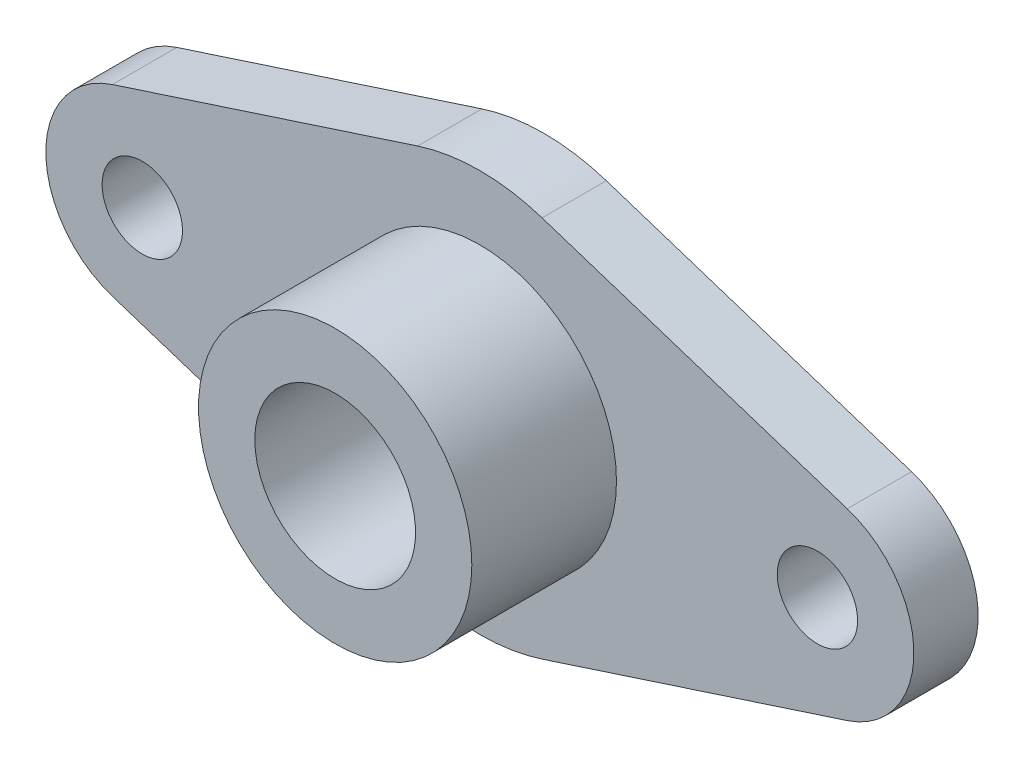
ISO-10303-21;
HEADER;
FILE_DESCRIPTION(('STEP AP214'),'2;1');
FILE_NAME('part.step','',(''),(''),'','','');
FILE_SCHEMA(('AUTOMOTIVE_DESIGN { 1 0 10303 214 1 1 1 1 }'));
ENDSEC;
DATA;
#1=APPLICATION_CONTEXT('core data for automotive mechanical design processes');
#2=APPLICATION_PROTOCOL_DEFINITION('international standard','automotive_design',2000,#1);
#3=PRODUCT_CONTEXT('',#1,'mechanical');
#4=PRODUCT('Part','Part','',(#3));
#5=PRODUCT_RELATED_PRODUCT_CATEGORY('part','',(#4));
#6=PRODUCT_DEFINITION_FORMATION('','',#4);
#7=PRODUCT_DEFINITION_CONTEXT('part definition',#1,'design');
#8=PRODUCT_DEFINITION('design','',#6,#7);
#9=PRODUCT_DEFINITION_SHAPE('','',#8);
#10=(LENGTH_UNIT() NAMED_UNIT(*) SI_UNIT(.MILLI.,.METRE.));
#11=(NAMED_UNIT(*) PLANE_ANGLE_UNIT() SI_UNIT($,.RADIAN.));
#12=(NAMED_UNIT(*) SI_UNIT($,.STERADIAN.) SOLID_ANGLE_UNIT());
#13=UNCERTAINTY_MEASURE_WITH_UNIT(LENGTH_MEASURE(1.E-05),#10,'distance_accuracy_value','');
#14=(GEOMETRIC_REPRESENTATION_CONTEXT(3) GLOBAL_UNCERTAINTY_ASSIGNED_CONTEXT((#13)) GLOBAL_UNIT_ASSIGNED_CONTEXT((#10,
#11,#12)) REPRESENTATION_CONTEXT('',''));
#15=CARTESIAN_POINT('',(0.,0.,0.));
#16=DIRECTION('',(0.,0.,1.));
#17=DIRECTION('',(1.,0.,0.));
#18=AXIS2_PLACEMENT_3D('',#15,#16,#17);
#19=CARTESIAN_POINT('',(0.,-0.0001472342694743,8.));
#20=DIRECTION('',(0.,0.,-1.));
#21=DIRECTION('',(-1.,0.,0.));
#22=AXIS2_PLACEMENT_3D('',#19,#20,#21);
#23=CYLINDRICAL_SURFACE('',#22,25.0001472342695);
#24=CARTESIAN_POINT('',(0.,-0.0001472342694743,0.));
#25=DIRECTION('',(0.,0.,1.));
#26=DIRECTION('',(1.,0.,0.));
#27=AXIS2_PLACEMENT_3D('',#24,#25,#26);
#28=CIRCLE('',#27,25.0001472342695);
#29=CARTESIAN_POINT('',(7.738095,23.7723,0.));
#30=VERTEX_POINT('',#29);
#31=CARTESIAN_POINT('',(-7.738095,23.7723,0.));
#32=VERTEX_POINT('',#31);
#33=EDGE_CURVE('E150',#30,#32,#28,.T.);
#34=ORIENTED_EDGE('',*,*,#33,.T.);
#35=DIRECTION('',(0.,0.,-1.));
#36=VECTOR('',#35,1.);
#37=CARTESIAN_POINT('',(-7.738095,23.7723,8.));
#38=LINE('',#37,#36);
#39=CARTESIAN_POINT('',(-7.738095,23.7723,8.));
#40=VERTEX_POINT('',#39);
#41=EDGE_CURVE('E48',#40,#32,#38,.T.);
#42=ORIENTED_EDGE('',*,*,#41,.F.);
#43=CARTESIAN_POINT('',(0.,-0.0001472342694743,8.));
#44=DIRECTION('',(0.,0.,1.));
#45=DIRECTION('',(1.,0.,0.));
#46=AXIS2_PLACEMENT_3D('',#43,#44,#45);
#47=CIRCLE('',#46,25.0001472342695);
#48=CARTESIAN_POINT('',(7.738095,23.7723,8.));
#49=VERTEX_POINT('',#48);
#50=EDGE_CURVE('E171',#49,#40,#47,.T.);
#51=ORIENTED_EDGE('',*,*,#50,.F.);
#52=DIRECTION('',(0.,0.,-1.));
#53=VECTOR('',#52,1.);
#54=CARTESIAN_POINT('',(7.738095,23.7723,8.));
#55=LINE('',#54,#53);
#56=EDGE_CURVE('E146',#49,#30,#55,.T.);
#57=ORIENTED_EDGE('',*,*,#56,.T.);
#58=EDGE_LOOP('',(#34,#42,#51,#57));
#59=FACE_BOUND('',#58,.T.);
#60=ADVANCED_FACE('F45',(#59),#23,.T.);
#61=CARTESIAN_POINT('',(-7.738095,23.7723,8.));
#62=DIRECTION('',(0.309523896094941,-0.950891664568687,0.));
#63=DIRECTION('',(0.950891664568687,0.309523896094941,0.));
#64=AXIS2_PLACEMENT_3D('',#61,#62,#63);
#65=PLANE('',#64);
#66=DIRECTION('',(-0.950891664568687,-0.309523896094941,0.));
#67=VECTOR('',#66,1.);
#68=CARTESIAN_POINT('',(-7.738095,23.7723,0.));
#69=LINE('',#68,#67);
#70=CARTESIAN_POINT('',(-45.714286,11.410704,0.));
#71=VERTEX_POINT('',#70);
#72=EDGE_CURVE('E153',#32,#71,#69,.T.);
#73=ORIENTED_EDGE('',*,*,#72,.T.);
#74=DIRECTION('',(0.,0.,-1.));
#75=VECTOR('',#74,1.);
#76=CARTESIAN_POINT('',(-45.714286,11.410704,8.));
#77=LINE('',#76,#75);
#78=CARTESIAN_POINT('',(-45.714286,11.410704,8.));
#79=VERTEX_POINT('',#78);
#80=EDGE_CURVE('E185',#79,#71,#77,.T.);
#81=ORIENTED_EDGE('',*,*,#80,.F.);
#82=DIRECTION('',(-0.950891664568687,-0.309523896094941,0.));
#83=VECTOR('',#82,1.);
#84=CARTESIAN_POINT('',(-7.738095,23.7723,8.));
#85=LINE('',#84,#83);
#86=EDGE_CURVE('E107',#40,#79,#85,.T.);
#87=ORIENTED_EDGE('',*,*,#86,.F.);
#88=ORIENTED_EDGE('',*,*,#41,.T.);
#89=EDGE_LOOP('',(#73,#81,#87,#88));
#90=FACE_BOUND('',#89,.T.);
#91=ADVANCED_FACE('F195',(#90),#65,.F.);
#92=CARTESIAN_POINT('',(-41.9999947943284,0.,8.));
#93=DIRECTION('',(0.,0.,-1.));
#94=DIRECTION('',(-1.,0.,0.));
#95=AXIS2_PLACEMENT_3D('',#92,#93,#94);
#96=CYLINDRICAL_SURFACE('',#95,12.0000052056716);
#97=CARTESIAN_POINT('',(-41.9999947943284,0.,0.));
#98=DIRECTION('',(0.,0.,1.));
#99=DIRECTION('',(1.,0.,0.));
#100=AXIS2_PLACEMENT_3D('',#97,#98,#99);
#101=CIRCLE('',#100,12.0000052056716);
#102=CARTESIAN_POINT('',(-45.714286,-11.410704,0.));
#103=VERTEX_POINT('',#102);
#104=EDGE_CURVE('E157',#71,#103,#101,.T.);
#105=ORIENTED_EDGE('',*,*,#104,.T.);
#106=DIRECTION('',(0.,0.,-1.));
#107=VECTOR('',#106,1.);
#108=CARTESIAN_POINT('',(-45.714286,-11.410704,8.));
#109=LINE('',#108,#107);
#110=CARTESIAN_POINT('',(-45.714286,-11.410704,8.));
#111=VERTEX_POINT('',#110);
#112=EDGE_CURVE('E182',#111,#103,#109,.T.);
#113=ORIENTED_EDGE('',*,*,#112,.F.);
#114=CARTESIAN_POINT('',(-41.9999947943284,0.,8.));
#115=DIRECTION('',(0.,0.,1.));
#116=DIRECTION('',(1.,0.,0.));
#117=AXIS2_PLACEMENT_3D('',#114,#115,#116);
#118=CIRCLE('',#117,12.0000052056716);
#119=EDGE_CURVE('E211',#79,#111,#118,.T.);
#120=ORIENTED_EDGE('',*,*,#119,.F.);
#121=ORIENTED_EDGE('',*,*,#80,.T.);
#122=EDGE_LOOP('',(#105,#113,#120,#121));
#123=FACE_BOUND('',#122,.T.);
#124=ADVANCED_FACE('F204',(#123),#96,.T.);
#125=CARTESIAN_POINT('',(-45.714286,-11.410704,8.));
#126=DIRECTION('',(0.309523896094941,0.950891664568687,0.));
#127=DIRECTION('',(-0.950891664568687,0.309523896094941,0.));
#128=AXIS2_PLACEMENT_3D('',#125,#126,#127);
#129=PLANE('',#128);
#130=DIRECTION('',(0.950891664568687,-0.309523896094941,0.));
#131=VECTOR('',#130,1.);
#132=CARTESIAN_POINT('',(-45.714286,-11.410704,0.));
#133=LINE('',#132,#131);
#134=CARTESIAN_POINT('',(-7.73809500000001,-23.7723,0.));
#135=VERTEX_POINT('',#134);
#136=EDGE_CURVE('E159',#103,#135,#133,.T.);
#137=ORIENTED_EDGE('',*,*,#136,.T.);
#138=DIRECTION('',(0.,0.,-1.));
#139=VECTOR('',#138,1.);
#140=CARTESIAN_POINT('',(-7.73809500000001,-23.7723,8.));
#141=LINE('',#140,#139);
#142=CARTESIAN_POINT('',(-7.73809500000001,-23.7723,8.));
#143=VERTEX_POINT('',#142);
#144=EDGE_CURVE('E178',#143,#135,#141,.T.);
#145=ORIENTED_EDGE('',*,*,#144,.F.);
#146=DIRECTION('',(0.950891664568687,-0.309523896094941,0.));
#147=VECTOR('',#146,1.);
#148=CARTESIAN_POINT('',(-45.714286,-11.410704,8.));
#149=LINE('',#148,#147);
#150=EDGE_CURVE('E209',#111,#143,#149,.T.);
#151=ORIENTED_EDGE('',*,*,#150,.F.);
#152=ORIENTED_EDGE('',*,*,#112,.T.);
#153=EDGE_LOOP('',(#137,#145,#151,#152));
#154=FACE_BOUND('',#153,.T.);
#155=ADVANCED_FACE('F207',(#154),#129,.F.);
#156=CARTESIAN_POINT('',(0.,0.0001472342694743,8.));
#157=DIRECTION('',(0.,0.,-1.));
#158=DIRECTION('',(-1.,0.,0.));
#159=AXIS2_PLACEMENT_3D('',#156,#157,#158);
#160=CYLINDRICAL_SURFACE('',#159,25.0001472342695);
#161=CARTESIAN_POINT('',(0.,0.0001472342694743,0.));
#162=DIRECTION('',(0.,0.,1.));
#163=DIRECTION('',(1.,0.,0.));
#164=AXIS2_PLACEMENT_3D('',#161,#162,#163);
#165=CIRCLE('',#164,25.0001472342695);
#166=CARTESIAN_POINT('',(7.738095,-23.7723,0.));
#167=VERTEX_POINT('',#166);
#168=EDGE_CURVE('E162',#135,#167,#165,.T.);
#169=ORIENTED_EDGE('',*,*,#168,.T.);
#170=DIRECTION('',(0.,0.,-1.));
#171=VECTOR('',#170,1.);
#172=CARTESIAN_POINT('',(7.738095,-23.7723,8.));
#173=LINE('',#172,#171);
#174=CARTESIAN_POINT('',(7.738095,-23.7723,8.));
#175=VERTEX_POINT('',#174);
#176=EDGE_CURVE('E137',#175,#167,#173,.T.);
#177=ORIENTED_EDGE('',*,*,#176,.F.);
#178=CARTESIAN_POINT('',(0.,0.0001472342694743,8.));
#179=DIRECTION('',(0.,0.,1.));
#180=DIRECTION('',(1.,0.,0.));
#181=AXIS2_PLACEMENT_3D('',#178,#179,#180);
#182=CIRCLE('',#181,25.0001472342695);
#183=EDGE_CURVE('E126',#143,#175,#182,.T.);
#184=ORIENTED_EDGE('',*,*,#183,.F.);
#185=ORIENTED_EDGE('',*,*,#144,.T.);
#186=EDGE_LOOP('',(#169,#177,#184,#185));
#187=FACE_BOUND('',#186,.T.);
#188=ADVANCED_FACE('F269',(#187),#160,.T.);
#189=CARTESIAN_POINT('',(7.738095,-23.7723,8.));
#190=DIRECTION('',(-0.309523896094941,0.950891664568687,0.));
#191=DIRECTION('',(-0.950891664568687,-0.309523896094941,0.));
#192=AXIS2_PLACEMENT_3D('',#189,#190,#191);
#193=PLANE('',#192);
#194=DIRECTION('',(0.950891664568687,0.309523896094941,0.));
#195=VECTOR('',#194,1.);
#196=CARTESIAN_POINT('',(7.738095,-23.7723,0.));
#197=LINE('',#196,#195);
#198=CARTESIAN_POINT('',(45.714286,-11.410704,0.));
#199=VERTEX_POINT('',#198);
#200=EDGE_CURVE('E135',#167,#199,#197,.T.);
#201=ORIENTED_EDGE('',*,*,#200,.T.);
#202=DIRECTION('',(0.,0.,-1.));
#203=VECTOR('',#202,1.);
#204=CARTESIAN_POINT('',(45.714286,-11.410704,8.));
#205=LINE('',#204,#203);
#206=CARTESIAN_POINT('',(45.714286,-11.410704,8.));
#207=VERTEX_POINT('',#206);
#208=EDGE_CURVE('E132',#207,#199,#205,.T.);
#209=ORIENTED_EDGE('',*,*,#208,.F.);
#210=DIRECTION('',(0.950891664568687,0.309523896094941,0.));
#211=VECTOR('',#210,1.);
#212=CARTESIAN_POINT('',(7.738095,-23.7723,8.));
#213=LINE('',#212,#211);
#214=EDGE_CURVE('E120',#175,#207,#213,.T.);
#215=ORIENTED_EDGE('',*,*,#214,.F.);
#216=ORIENTED_EDGE('',*,*,#176,.T.);
#217=EDGE_LOOP('',(#201,#209,#215,#216));
#218=FACE_BOUND('',#217,.T.);
#219=ADVANCED_FACE('F133',(#218),#193,.F.);
#220=CARTESIAN_POINT('',(41.9999947943284,0.,8.));
#221=DIRECTION('',(0.,0.,-1.));
#222=DIRECTION('',(-1.,0.,0.));
#223=AXIS2_PLACEMENT_3D('',#220,#221,#222);
#224=CYLINDRICAL_SURFACE('',#223,12.0000052056716);
#225=CARTESIAN_POINT('',(41.9999947943284,0.,0.));
#226=DIRECTION('',(0.,0.,1.));
#227=DIRECTION('',(1.,0.,0.));
#228=AXIS2_PLACEMENT_3D('',#225,#226,#227);
#229=CIRCLE('',#228,12.0000052056716);
#230=CARTESIAN_POINT('',(45.714286,11.410704,0.));
#231=VERTEX_POINT('',#230);
#232=EDGE_CURVE('E92',#199,#231,#229,.T.);
#233=ORIENTED_EDGE('',*,*,#232,.T.);
#234=DIRECTION('',(0.,0.,-1.));
#235=VECTOR('',#234,1.);
#236=CARTESIAN_POINT('',(45.714286,11.410704,8.));
#237=LINE('',#236,#235);
#238=CARTESIAN_POINT('',(45.714286,11.410704,8.));
#239=VERTEX_POINT('',#238);
#240=EDGE_CURVE('E138',#239,#231,#237,.T.);
#241=ORIENTED_EDGE('',*,*,#240,.F.);
#242=CARTESIAN_POINT('',(41.9999947943284,0.,8.));
#243=DIRECTION('',(0.,0.,1.));
#244=DIRECTION('',(1.,0.,0.));
#245=AXIS2_PLACEMENT_3D('',#242,#243,#244);
#246=CIRCLE('',#245,12.0000052056716);
#247=EDGE_CURVE('E124',#207,#239,#246,.T.);
#248=ORIENTED_EDGE('',*,*,#247,.F.);
#249=ORIENTED_EDGE('',*,*,#208,.T.);
#250=EDGE_LOOP('',(#233,#241,#248,#249));
#251=FACE_BOUND('',#250,.T.);
#252=ADVANCED_FACE('F140',(#251),#224,.T.);
#253=CARTESIAN_POINT('',(45.714286,11.410704,8.));
#254=DIRECTION('',(-0.309523896094941,-0.950891664568687,0.));
#255=DIRECTION('',(0.950891664568687,-0.309523896094941,0.));
#256=AXIS2_PLACEMENT_3D('',#253,#254,#255);
#257=PLANE('',#256);
#258=DIRECTION('',(-0.950891664568687,0.309523896094941,0.));
#259=VECTOR('',#258,1.);
#260=CARTESIAN_POINT('',(45.714286,11.410704,0.));
#261=LINE('',#260,#259);
#262=EDGE_CURVE('E98',#231,#30,#261,.T.);
#263=ORIENTED_EDGE('',*,*,#262,.T.);
#264=ORIENTED_EDGE('',*,*,#56,.F.);
#265=DIRECTION('',(-0.950891664568687,0.309523896094941,0.));
#266=VECTOR('',#265,1.);
#267=CARTESIAN_POINT('',(45.714286,11.410704,8.));
#268=LINE('',#267,#266);
#269=EDGE_CURVE('E63',#239,#49,#268,.T.);
#270=ORIENTED_EDGE('',*,*,#269,.F.);
#271=ORIENTED_EDGE('',*,*,#240,.T.);
#272=EDGE_LOOP('',(#263,#264,#270,#271));
#273=FACE_BOUND('',#272,.T.);
#274=ADVANCED_FACE('F277',(#273),#257,.F.);
#275=CARTESIAN_POINT('',(0.,-0.0001472342694743,8.));
#276=DIRECTION('',(0.,0.,1.));
#277=DIRECTION('',(1.,0.,0.));
#278=AXIS2_PLACEMENT_3D('',#275,#276,#277);
#279=PLANE('',#278);
#280=CARTESIAN_POINT('',(42.,0.,8.));
#281=DIRECTION('',(0.,0.,1.));
#282=DIRECTION('',(1.,0.,0.));
#283=AXIS2_PLACEMENT_3D('',#280,#281,#282);
#284=CIRCLE('',#283,5.);
#285=CARTESIAN_POINT('',(37.,0.,8.));
#286=VERTEX_POINT('',#285);
#287=EDGE_CURVE('E228',#286,#286,#284,.F.);
#288=ORIENTED_EDGE('',*,*,#287,.T.);
#289=EDGE_LOOP('',(#288));
#290=FACE_BOUND('',#289,.T.);
#291=CARTESIAN_POINT('',(-42.,0.,8.));
#292=DIRECTION('',(0.,0.,1.));
#293=DIRECTION('',(1.,0.,0.));
#294=AXIS2_PLACEMENT_3D('',#291,#292,#293);
#295=CIRCLE('',#294,5.);
#296=CARTESIAN_POINT('',(-47.,0.,8.));
#297=VERTEX_POINT('',#296);
#298=EDGE_CURVE('E235',#297,#297,#295,.F.);
#299=ORIENTED_EDGE('',*,*,#298,.T.);
#300=EDGE_LOOP('',(#299));
#301=FACE_BOUND('',#300,.T.);
#302=CARTESIAN_POINT('',(0.,0.,8.));
#303=DIRECTION('',(0.,0.,1.));
#304=DIRECTION('',(1.,0.,0.));
#305=AXIS2_PLACEMENT_3D('',#302,#303,#304);
#306=CIRCLE('',#305,17.);
#307=CARTESIAN_POINT('',(17.,0.,8.));
#308=VERTEX_POINT('',#307);
#309=EDGE_CURVE('E11',#308,#308,#306,.T.);
#310=ORIENTED_EDGE('',*,*,#309,.F.);
#311=EDGE_LOOP('',(#310));
#312=FACE_BOUND('',#311,.T.);
#313=ORIENTED_EDGE('',*,*,#50,.T.);
#314=ORIENTED_EDGE('',*,*,#86,.T.);
#315=ORIENTED_EDGE('',*,*,#119,.T.);
#316=ORIENTED_EDGE('',*,*,#150,.T.);
#317=ORIENTED_EDGE('',*,*,#183,.T.);
#318=ORIENTED_EDGE('',*,*,#214,.T.);
#319=ORIENTED_EDGE('',*,*,#247,.T.);
#320=ORIENTED_EDGE('',*,*,#269,.T.);
#321=EDGE_LOOP('',(#313,#314,#315,#316,#317,#318,#319,#320));
#322=FACE_BOUND('',#321,.T.);
#323=ADVANCED_FACE('F122',(#290,#301,#312,#322),#279,.T.);
#324=CARTESIAN_POINT('',(0.,-0.0001472342694743,0.));
#325=DIRECTION('',(0.,0.,1.));
#326=DIRECTION('',(1.,0.,0.));
#327=AXIS2_PLACEMENT_3D('',#324,#325,#326);
#328=PLANE('',#327);
#329=CARTESIAN_POINT('',(42.,0.,0.));
#330=DIRECTION('',(0.,0.,1.));
#331=DIRECTION('',(1.,0.,0.));
#332=AXIS2_PLACEMENT_3D('',#329,#330,#331);
#333=CIRCLE('',#332,5.);
#334=CARTESIAN_POINT('',(37.,0.,0.));
#335=VERTEX_POINT('',#334);
#336=EDGE_CURVE('E238',#335,#335,#333,.T.);
#337=ORIENTED_EDGE('',*,*,#336,.T.);
#338=EDGE_LOOP('',(#337));
#339=FACE_BOUND('',#338,.T.);
#340=CARTESIAN_POINT('',(-42.,0.,0.));
#341=DIRECTION('',(0.,0.,1.));
#342=DIRECTION('',(1.,0.,0.));
#343=AXIS2_PLACEMENT_3D('',#340,#341,#342);
#344=CIRCLE('',#343,5.);
#345=CARTESIAN_POINT('',(-47.,0.,0.));
#346=VERTEX_POINT('',#345);
#347=EDGE_CURVE('E239',#346,#346,#344,.T.);
#348=ORIENTED_EDGE('',*,*,#347,.T.);
#349=EDGE_LOOP('',(#348));
#350=FACE_BOUND('',#349,.T.);
#351=CARTESIAN_POINT('',(0.,0.,0.));
#352=DIRECTION('',(0.,0.,1.));
#353=DIRECTION('',(1.,0.,0.));
#354=AXIS2_PLACEMENT_3D('',#351,#352,#353);
#355=CIRCLE('',#354,10.);
#356=CARTESIAN_POINT('',(-10.,0.,0.));
#357=VERTEX_POINT('',#356);
#358=EDGE_CURVE('E224',#357,#357,#355,.T.);
#359=ORIENTED_EDGE('',*,*,#358,.T.);
#360=EDGE_LOOP('',(#359));
#361=FACE_BOUND('',#360,.T.);
#362=ORIENTED_EDGE('',*,*,#33,.F.);
#363=ORIENTED_EDGE('',*,*,#262,.F.);
#364=ORIENTED_EDGE('',*,*,#232,.F.);
#365=ORIENTED_EDGE('',*,*,#200,.F.);
#366=ORIENTED_EDGE('',*,*,#168,.F.);
#367=ORIENTED_EDGE('',*,*,#136,.F.);
#368=ORIENTED_EDGE('',*,*,#104,.F.);
#369=ORIENTED_EDGE('',*,*,#72,.F.);
#370=EDGE_LOOP('',(#362,#363,#364,#365,#366,#367,#368,#369));
#371=FACE_BOUND('',#370,.T.);
#372=ADVANCED_FACE('F200',(#339,#350,#361,#371),#328,.F.);
#373=CARTESIAN_POINT('',(0.,0.,26.));
#374=DIRECTION('',(0.,0.,-1.));
#375=DIRECTION('',(-1.,0.,0.));
#376=AXIS2_PLACEMENT_3D('',#373,#374,#375);
#377=CYLINDRICAL_SURFACE('',#376,17.);
#378=CARTESIAN_POINT('',(0.,0.,26.));
#379=DIRECTION('',(0.,0.,1.));
#380=DIRECTION('',(1.,0.,0.));
#381=AXIS2_PLACEMENT_3D('',#378,#379,#380);
#382=CIRCLE('',#381,17.);
#383=CARTESIAN_POINT('',(17.,0.,26.));
#384=VERTEX_POINT('',#383);
#385=EDGE_CURVE('E154',#384,#384,#382,.T.);
#386=ORIENTED_EDGE('',*,*,#385,.F.);
#387=EDGE_LOOP('',(#386));
#388=FACE_BOUND('',#387,.T.);
#389=ORIENTED_EDGE('',*,*,#309,.T.);
#390=EDGE_LOOP('',(#389));
#391=FACE_BOUND('',#390,.T.);
#392=ADVANCED_FACE('F282',(#388,#391),#377,.T.);
#393=CARTESIAN_POINT('',(0.,0.,26.));
#394=DIRECTION('',(0.,0.,1.));
#395=DIRECTION('',(1.,0.,0.));
#396=AXIS2_PLACEMENT_3D('',#393,#394,#395);
#397=PLANE('',#396);
#398=CARTESIAN_POINT('',(0.,0.,26.));
#399=DIRECTION('',(0.,0.,1.));
#400=DIRECTION('',(1.,0.,0.));
#401=AXIS2_PLACEMENT_3D('',#398,#399,#400);
#402=CIRCLE('',#401,10.);
#403=CARTESIAN_POINT('',(-10.,0.,26.));
#404=VERTEX_POINT('',#403);
#405=EDGE_CURVE('E223',#404,#404,#402,.T.);
#406=ORIENTED_EDGE('',*,*,#405,.F.);
#407=EDGE_LOOP('',(#406));
#408=FACE_BOUND('',#407,.T.);
#409=ORIENTED_EDGE('',*,*,#385,.T.);
#410=EDGE_LOOP('',(#409));
#411=FACE_BOUND('',#410,.T.);
#412=ADVANCED_FACE('F288',(#408,#411),#397,.T.);
#413=CARTESIAN_POINT('',(0.,0.,26.));
#414=DIRECTION('',(0.,0.,-1.));
#415=DIRECTION('',(-1.,0.,0.));
#416=AXIS2_PLACEMENT_3D('',#413,#414,#415);
#417=CYLINDRICAL_SURFACE('',#416,10.);
#418=CARTESIAN_POINT('',(-10.,0.,26.));
#419=CARTESIAN_POINT('',(-10.,0.,25.7291666666667));
#420=CARTESIAN_POINT('',(-10.,0.,25.4583333333333));
#421=CARTESIAN_POINT('',(-10.,0.,24.9166666666667));
#422=CARTESIAN_POINT('',(-10.,0.,24.6458333333333));
#423=CARTESIAN_POINT('',(-10.,0.,24.1041666666667));
#424=CARTESIAN_POINT('',(-10.,0.,23.8333333333333));
#425=CARTESIAN_POINT('',(-10.,0.,23.2916666666667));
#426=CARTESIAN_POINT('',(-10.,0.,23.0208333333333));
#427=CARTESIAN_POINT('',(-10.,0.,22.4791666666667));
#428=CARTESIAN_POINT('',(-10.,0.,22.2083333333333));
#429=CARTESIAN_POINT('',(-10.,0.,21.6666666666667));
#430=CARTESIAN_POINT('',(-10.,0.,21.3958333333333));
#431=CARTESIAN_POINT('',(-10.,0.,20.8541666666667));
#432=CARTESIAN_POINT('',(-10.,0.,20.5833333333333));
#433=CARTESIAN_POINT('',(-10.,0.,20.0416666666667));
#434=CARTESIAN_POINT('',(-10.,0.,19.7708333333333));
#435=CARTESIAN_POINT('',(-10.,0.,19.2291666666667));
#436=CARTESIAN_POINT('',(-10.,0.,18.9583333333333));
#437=CARTESIAN_POINT('',(-10.,0.,18.4166666666667));
#438=CARTESIAN_POINT('',(-10.,0.,18.1458333333333));
#439=CARTESIAN_POINT('',(-10.,0.,17.6041666666667));
#440=CARTESIAN_POINT('',(-10.,0.,17.3333333333333));
#441=CARTESIAN_POINT('',(-10.,0.,16.7916666666667));
#442=CARTESIAN_POINT('',(-10.,0.,16.5208333333333));
#443=CARTESIAN_POINT('',(-10.,0.,15.9791666666667));
#444=CARTESIAN_POINT('',(-10.,0.,15.7083333333333));
#445=CARTESIAN_POINT('',(-10.,0.,15.1666666666667));
#446=CARTESIAN_POINT('',(-10.,0.,14.8958333333333));
#447=CARTESIAN_POINT('',(-10.,0.,14.3541666666667));
#448=CARTESIAN_POINT('',(-10.,0.,14.0833333333333));
#449=CARTESIAN_POINT('',(-10.,0.,13.5416666666667));
#450=CARTESIAN_POINT('',(-10.,0.,13.2708333333333));
#451=CARTESIAN_POINT('',(-10.,0.,12.7291666666667));
#452=CARTESIAN_POINT('',(-10.,0.,12.4583333333333));
#453=CARTESIAN_POINT('',(-10.,0.,11.9166666666667));
#454=CARTESIAN_POINT('',(-10.,0.,11.6458333333333));
#455=CARTESIAN_POINT('',(-10.,0.,11.1041666666667));
#456=CARTESIAN_POINT('',(-10.,0.,10.8333333333333));
#457=CARTESIAN_POINT('',(-10.,0.,10.2916666666667));
#458=CARTESIAN_POINT('',(-10.,0.,10.0208333333333));
#459=CARTESIAN_POINT('',(-10.,0.,9.47916666666667));
#460=CARTESIAN_POINT('',(-10.,0.,9.20833333333333));
#461=CARTESIAN_POINT('',(-10.,0.,8.66666666666667));
#462=CARTESIAN_POINT('',(-10.,0.,8.39583333333333));
#463=CARTESIAN_POINT('',(-10.,0.,7.85416666666667));
#464=CARTESIAN_POINT('',(-10.,0.,7.58333333333333));
#465=CARTESIAN_POINT('',(-10.,0.,7.04166666666667));
#466=CARTESIAN_POINT('',(-10.,0.,6.77083333333333));
#467=CARTESIAN_POINT('',(-10.,0.,6.22916666666667));
#468=CARTESIAN_POINT('',(-10.,0.,5.95833333333333));
#469=CARTESIAN_POINT('',(-10.,0.,5.41666666666667));
#470=CARTESIAN_POINT('',(-10.,0.,5.14583333333333));
#471=CARTESIAN_POINT('',(-10.,0.,4.60416666666667));
#472=CARTESIAN_POINT('',(-10.,0.,4.33333333333333));
#473=CARTESIAN_POINT('',(-10.,0.,3.79166666666667));
#474=CARTESIAN_POINT('',(-10.,0.,3.52083333333333));
#475=CARTESIAN_POINT('',(-10.,0.,2.97916666666667));
#476=CARTESIAN_POINT('',(-10.,0.,2.70833333333333));
#477=CARTESIAN_POINT('',(-10.,0.,2.16666666666667));
#478=CARTESIAN_POINT('',(-10.,0.,1.89583333333333));
#479=CARTESIAN_POINT('',(-10.,0.,1.35416666666667));
#480=CARTESIAN_POINT('',(-10.,0.,1.08333333333333));
#481=CARTESIAN_POINT('',(-10.,0.,0.541666666666667));
#482=CARTESIAN_POINT('',(-10.,0.,0.270833333333334));
#483=CARTESIAN_POINT('',(-10.,0.,0.));
#484=B_SPLINE_CURVE_WITH_KNOTS('',3,(#418,#419,#420,#421,#422,#423,#424,#425,#426,#427,#428,
#429,#430,#431,#432,#433,#434,#435,#436,#437,#438,#439,#440,#441,#442,#443,#444,#445,#446,#447,
#448,#449,#450,#451,#452,#453,#454,#455,#456,#457,#458,#459,#460,#461,#462,#463,#464,#465,#466,
#467,#468,#469,#470,#471,#472,#473,#474,#475,#476,#477,#478,#479,#480,#481,#482,#483),
.UNSPECIFIED.,.F.,.F.,(4,2,2,2,2,2,2,2,2,2,2,2,2,2,2,2,2,2,2,2,2,2,2,2,2,2,2,2,2,2,2,2,4),(0.,
0.812499999999997,1.625,2.4375,3.25,4.0625,4.875,5.6875,6.5,7.3125,8.125,8.93749999999999,
9.74999999999999,10.5625,11.375,12.1875,13.,13.8125,14.625,15.4375,16.25,17.0625,17.875,18.6875,
19.5,20.3125,21.125,21.9375,22.75,23.5625,24.375,25.1875,26.),.UNSPECIFIED.);
#485=EDGE_CURVE('BSEAM256',#404,#357,#484,.T.);
#486=ORIENTED_EDGE('',*,*,#405,.T.);
#487=ORIENTED_EDGE('',*,*,#358,.F.);
#488=ORIENTED_EDGE('',*,*,#485,.T.);
#489=ORIENTED_EDGE('',*,*,#485,.F.);
#490=EDGE_LOOP('',(#486,#488,#487,#489));
#491=FACE_BOUND('',#490,.T.);
#492=ADVANCED_FACE('F256',(#491),#417,.F.);
#493=CARTESIAN_POINT('',(-42.,0.,26.));
#494=DIRECTION('',(0.,0.,-1.));
#495=DIRECTION('',(-1.,0.,0.));
#496=AXIS2_PLACEMENT_3D('',#493,#494,#495);
#497=CYLINDRICAL_SURFACE('',#496,5.);
#498=CARTESIAN_POINT('',(-47.,0.,8.));
#499=CARTESIAN_POINT('',(-47.,0.,7.91666666666667));
#500=CARTESIAN_POINT('',(-47.,0.,7.83333333333333));
#501=CARTESIAN_POINT('',(-47.,0.,7.66666666666667));
#502=CARTESIAN_POINT('',(-47.,0.,7.58333333333333));
#503=CARTESIAN_POINT('',(-47.,0.,7.41666666666667));
#504=CARTESIAN_POINT('',(-47.,0.,7.33333333333333));
#505=CARTESIAN_POINT('',(-47.,0.,7.16666666666667));
#506=CARTESIAN_POINT('',(-47.,0.,7.08333333333333));
#507=CARTESIAN_POINT('',(-47.,0.,6.91666666666667));
#508=CARTESIAN_POINT('',(-47.,0.,6.83333333333333));
#509=CARTESIAN_POINT('',(-47.,0.,6.66666666666667));
#510=CARTESIAN_POINT('',(-47.,0.,6.58333333333333));
#511=CARTESIAN_POINT('',(-47.,0.,6.41666666666667));
#512=CARTESIAN_POINT('',(-47.,0.,6.33333333333333));
#513=CARTESIAN_POINT('',(-47.,0.,6.16666666666667));
#514=CARTESIAN_POINT('',(-47.,0.,6.08333333333333));
#515=CARTESIAN_POINT('',(-47.,0.,5.91666666666666));
#516=CARTESIAN_POINT('',(-47.,0.,5.83333333333333));
#517=CARTESIAN_POINT('',(-47.,0.,5.66666666666667));
#518=CARTESIAN_POINT('',(-47.,0.,5.58333333333333));
#519=CARTESIAN_POINT('',(-47.,0.,5.41666666666667));
#520=CARTESIAN_POINT('',(-47.,0.,5.33333333333333));
#521=CARTESIAN_POINT('',(-47.,0.,5.16666666666667));
#522=CARTESIAN_POINT('',(-47.,0.,5.08333333333333));
#523=CARTESIAN_POINT('',(-47.,0.,4.91666666666667));
#524=CARTESIAN_POINT('',(-47.,0.,4.83333333333333));
#525=CARTESIAN_POINT('',(-47.,0.,4.66666666666667));
#526=CARTESIAN_POINT('',(-47.,0.,4.58333333333333));
#527=CARTESIAN_POINT('',(-47.,0.,4.41666666666667));
#528=CARTESIAN_POINT('',(-47.,0.,4.33333333333333));
#529=CARTESIAN_POINT('',(-47.,0.,4.16666666666667));
#530=CARTESIAN_POINT('',(-47.,0.,4.08333333333333));
#531=CARTESIAN_POINT('',(-47.,0.,3.91666666666667));
#532=CARTESIAN_POINT('',(-47.,0.,3.83333333333333));
#533=CARTESIAN_POINT('',(-47.,0.,3.66666666666667));
#534=CARTESIAN_POINT('',(-47.,0.,3.58333333333333));
#535=CARTESIAN_POINT('',(-47.,0.,3.41666666666667));
#536=CARTESIAN_POINT('',(-47.,0.,3.33333333333333));
#537=CARTESIAN_POINT('',(-47.,0.,3.16666666666667));
#538=CARTESIAN_POINT('',(-47.,0.,3.08333333333333));
#539=CARTESIAN_POINT('',(-47.,0.,2.91666666666667));
#540=CARTESIAN_POINT('',(-47.,0.,2.83333333333333));
#541=CARTESIAN_POINT('',(-47.,0.,2.66666666666667));
#542=CARTESIAN_POINT('',(-47.,0.,2.58333333333333));
#543=CARTESIAN_POINT('',(-47.,0.,2.41666666666667));
#544=CARTESIAN_POINT('',(-47.,0.,2.33333333333334));
#545=CARTESIAN_POINT('',(-47.,0.,2.16666666666667));
#546=CARTESIAN_POINT('',(-47.,0.,2.08333333333334));
#547=CARTESIAN_POINT('',(-47.,0.,1.91666666666667));
#548=CARTESIAN_POINT('',(-47.,0.,1.83333333333334));
#549=CARTESIAN_POINT('',(-47.,0.,1.66666666666667));
#550=CARTESIAN_POINT('',(-47.,0.,1.58333333333333));
#551=CARTESIAN_POINT('',(-47.,0.,1.41666666666667));
#552=CARTESIAN_POINT('',(-47.,0.,1.33333333333333));
#553=CARTESIAN_POINT('',(-47.,0.,1.16666666666667));
#554=CARTESIAN_POINT('',(-47.,0.,1.08333333333333));
#555=CARTESIAN_POINT('',(-47.,0.,0.916666666666668));
#556=CARTESIAN_POINT('',(-47.,0.,0.833333333333334));
#557=CARTESIAN_POINT('',(-47.,0.,0.666666666666667));
#558=CARTESIAN_POINT('',(-47.,0.,0.583333333333334));
#559=CARTESIAN_POINT('',(-47.,0.,0.416666666666667));
#560=CARTESIAN_POINT('',(-47.,0.,0.333333333333334));
#561=CARTESIAN_POINT('',(-47.,0.,0.166666666666667));
#562=CARTESIAN_POINT('',(-47.,0.,0.0833333333333333));
#563=CARTESIAN_POINT('',(-47.,0.,0.));
#564=B_SPLINE_CURVE_WITH_KNOTS('',3,(#498,#499,#500,#501,#502,#503,#504,#505,#506,#507,#508,
#509,#510,#511,#512,#513,#514,#515,#516,#517,#518,#519,#520,#521,#522,#523,#524,#525,#526,#527,
#528,#529,#530,#531,#532,#533,#534,#535,#536,#537,#538,#539,#540,#541,#542,#543,#544,#545,#546,
#547,#548,#549,#550,#551,#552,#553,#554,#555,#556,#557,#558,#559,#560,#561,#562,#563),
.UNSPECIFIED.,.F.,.F.,(4,2,2,2,2,2,2,2,2,2,2,2,2,2,2,2,2,2,2,2,2,2,2,2,2,2,2,2,2,2,2,2,4),(0.,
0.25,0.5,0.750000000000001,1.,1.25,1.5,1.75,2.,2.25,2.5,2.75,3.,3.25,3.5,3.75,4.,4.25,4.5,4.75,
5.,5.25,5.5,5.75,6.,6.25,6.5,6.75,7.,7.25,7.5,7.75,8.),.UNSPECIFIED.);
#565=EDGE_CURVE('BSEAM251',#297,#346,#564,.T.);
#566=ORIENTED_EDGE('',*,*,#298,.F.);
#567=ORIENTED_EDGE('',*,*,#347,.F.);
#568=ORIENTED_EDGE('',*,*,#565,.T.);
#569=ORIENTED_EDGE('',*,*,#565,.F.);
#570=EDGE_LOOP('',(#566,#568,#567,#569));
#571=FACE_BOUND('',#570,.T.);
#572=ADVANCED_FACE('F251',(#571),#497,.F.);
#573=CARTESIAN_POINT('',(42.,0.,26.));
#574=DIRECTION('',(0.,0.,-1.));
#575=DIRECTION('',(-1.,0.,0.));
#576=AXIS2_PLACEMENT_3D('',#573,#574,#575);
#577=CYLINDRICAL_SURFACE('',#576,5.);
#578=CARTESIAN_POINT('',(37.,0.,8.));
#579=CARTESIAN_POINT('',(37.,0.,7.91666666666667));
#580=CARTESIAN_POINT('',(37.,0.,7.83333333333333));
#581=CARTESIAN_POINT('',(37.,0.,7.66666666666667));
#582=CARTESIAN_POINT('',(37.,0.,7.58333333333333));
#583=CARTESIAN_POINT('',(37.,0.,7.41666666666667));
#584=CARTESIAN_POINT('',(37.,0.,7.33333333333333));
#585=CARTESIAN_POINT('',(37.,0.,7.16666666666667));
#586=CARTESIAN_POINT('',(37.,0.,7.08333333333333));
#587=CARTESIAN_POINT('',(37.,0.,6.91666666666667));
#588=CARTESIAN_POINT('',(37.,0.,6.83333333333333));
#589=CARTESIAN_POINT('',(37.,0.,6.66666666666667));
#590=CARTESIAN_POINT('',(37.,0.,6.58333333333333));
#591=CARTESIAN_POINT('',(37.,0.,6.41666666666667));
#592=CARTESIAN_POINT('',(37.,0.,6.33333333333333));
#593=CARTESIAN_POINT('',(37.,0.,6.16666666666667));
#594=CARTESIAN_POINT('',(37.,0.,6.08333333333333));
#595=CARTESIAN_POINT('',(37.,0.,5.91666666666666));
#596=CARTESIAN_POINT('',(37.,0.,5.83333333333333));
#597=CARTESIAN_POINT('',(37.,0.,5.66666666666667));
#598=CARTESIAN_POINT('',(37.,0.,5.58333333333333));
#599=CARTESIAN_POINT('',(37.,0.,5.41666666666667));
#600=CARTESIAN_POINT('',(37.,0.,5.33333333333333));
#601=CARTESIAN_POINT('',(37.,0.,5.16666666666667));
#602=CARTESIAN_POINT('',(37.,0.,5.08333333333333));
#603=CARTESIAN_POINT('',(37.,0.,4.91666666666667));
#604=CARTESIAN_POINT('',(37.,0.,4.83333333333333));
#605=CARTESIAN_POINT('',(37.,0.,4.66666666666667));
#606=CARTESIAN_POINT('',(37.,0.,4.58333333333333));
#607=CARTESIAN_POINT('',(37.,0.,4.41666666666667));
#608=CARTESIAN_POINT('',(37.,0.,4.33333333333333));
#609=CARTESIAN_POINT('',(37.,0.,4.16666666666667));
#610=CARTESIAN_POINT('',(37.,0.,4.08333333333333));
#611=CARTESIAN_POINT('',(37.,0.,3.91666666666667));
#612=CARTESIAN_POINT('',(37.,0.,3.83333333333333));
#613=CARTESIAN_POINT('',(37.,0.,3.66666666666667));
#614=CARTESIAN_POINT('',(37.,0.,3.58333333333333));
#615=CARTESIAN_POINT('',(37.,0.,3.41666666666667));
#616=CARTESIAN_POINT('',(37.,0.,3.33333333333333));
#617=CARTESIAN_POINT('',(37.,0.,3.16666666666667));
#618=CARTESIAN_POINT('',(37.,0.,3.08333333333333));
#619=CARTESIAN_POINT('',(37.,0.,2.91666666666667));
#620=CARTESIAN_POINT('',(37.,0.,2.83333333333333));
#621=CARTESIAN_POINT('',(37.,0.,2.66666666666667));
#622=CARTESIAN_POINT('',(37.,0.,2.58333333333333));
#623=CARTESIAN_POINT('',(37.,0.,2.41666666666667));
#624=CARTESIAN_POINT('',(37.,0.,2.33333333333334));
#625=CARTESIAN_POINT('',(37.,0.,2.16666666666667));
#626=CARTESIAN_POINT('',(37.,0.,2.08333333333334));
#627=CARTESIAN_POINT('',(37.,0.,1.91666666666667));
#628=CARTESIAN_POINT('',(37.,0.,1.83333333333334));
#629=CARTESIAN_POINT('',(37.,0.,1.66666666666667));
#630=CARTESIAN_POINT('',(37.,0.,1.58333333333333));
#631=CARTESIAN_POINT('',(37.,0.,1.41666666666667));
#632=CARTESIAN_POINT('',(37.,0.,1.33333333333333));
#633=CARTESIAN_POINT('',(37.,0.,1.16666666666667));
#634=CARTESIAN_POINT('',(37.,0.,1.08333333333333));
#635=CARTESIAN_POINT('',(37.,0.,0.916666666666668));
#636=CARTESIAN_POINT('',(37.,0.,0.833333333333334));
#637=CARTESIAN_POINT('',(37.,0.,0.666666666666667));
#638=CARTESIAN_POINT('',(37.,0.,0.583333333333334));
#639=CARTESIAN_POINT('',(37.,0.,0.416666666666667));
#640=CARTESIAN_POINT('',(37.,0.,0.333333333333334));
#641=CARTESIAN_POINT('',(37.,0.,0.166666666666667));
#642=CARTESIAN_POINT('',(37.,0.,0.0833333333333333));
#643=CARTESIAN_POINT('',(37.,0.,0.));
#644=B_SPLINE_CURVE_WITH_KNOTS('',3,(#578,#579,#580,#581,#582,#583,#584,#585,#586,#587,#588,
#589,#590,#591,#592,#593,#594,#595,#596,#597,#598,#599,#600,#601,#602,#603,#604,#605,#606,#607,
#608,#609,#610,#611,#612,#613,#614,#615,#616,#617,#618,#619,#620,#621,#622,#623,#624,#625,#626,
#627,#628,#629,#630,#631,#632,#633,#634,#635,#636,#637,#638,#639,#640,#641,#642,#643),
.UNSPECIFIED.,.F.,.F.,(4,2,2,2,2,2,2,2,2,2,2,2,2,2,2,2,2,2,2,2,2,2,2,2,2,2,2,2,2,2,2,2,4),(0.,
0.25,0.5,0.750000000000001,1.,1.25,1.5,1.75,2.,2.25,2.5,2.75,3.,3.25,3.5,3.75,4.,4.25,4.5,4.75,
5.,5.25,5.5,5.75,6.,6.25,6.5,6.75,7.,7.25,7.5,7.75,8.),.UNSPECIFIED.);
#645=EDGE_CURVE('BSEAM249',#286,#335,#644,.T.);
#646=ORIENTED_EDGE('',*,*,#287,.F.);
#647=ORIENTED_EDGE('',*,*,#336,.F.);
#648=ORIENTED_EDGE('',*,*,#645,.T.);
#649=ORIENTED_EDGE('',*,*,#645,.F.);
#650=EDGE_LOOP('',(#646,#648,#647,#649));
#651=FACE_BOUND('',#650,.T.);
#652=ADVANCED_FACE('F249',(#651),#577,.F.);
#653=CLOSED_SHELL('',(#60,#91,#124,#155,#188,#219,#252,#274,#323,#372,#392,#412,#492,#572,#652));
#654=MANIFOLD_SOLID_BREP('B2',#653);
#655=ADVANCED_BREP_SHAPE_REPRESENTATION('',(#18,#654),#14);
#656=SHAPE_DEFINITION_REPRESENTATION(#9,#655);
ENDSEC;
END-ISO-10303-21;
